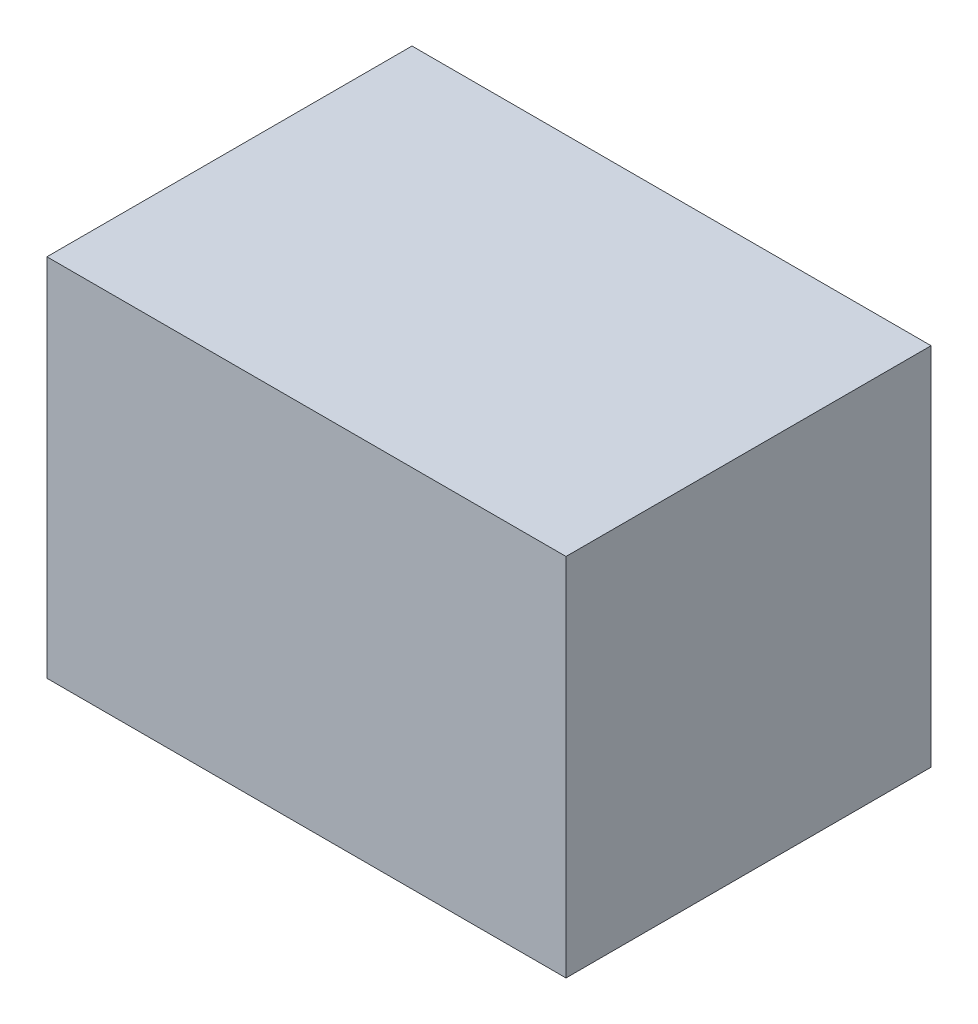
ISO-10303-21;
HEADER;
FILE_DESCRIPTION(('STEP AP214'),'2;1');
FILE_NAME('part.step','',(''),(''),'','','');
FILE_SCHEMA(('AUTOMOTIVE_DESIGN { 1 0 10303 214 1 1 1 1 }'));
ENDSEC;
DATA;
#1=APPLICATION_CONTEXT('core data for automotive mechanical design processes');
#2=APPLICATION_PROTOCOL_DEFINITION('international standard','automotive_design',2000,#1);
#3=PRODUCT_CONTEXT('',#1,'mechanical');
#4=PRODUCT('Part','Part','',(#3));
#5=PRODUCT_RELATED_PRODUCT_CATEGORY('part','',(#4));
#6=PRODUCT_DEFINITION_FORMATION('','',#4);
#7=PRODUCT_DEFINITION_CONTEXT('part definition',#1,'design');
#8=PRODUCT_DEFINITION('design','',#6,#7);
#9=PRODUCT_DEFINITION_SHAPE('','',#8);
#10=(LENGTH_UNIT() NAMED_UNIT(*) SI_UNIT(.MILLI.,.METRE.));
#11=(NAMED_UNIT(*) PLANE_ANGLE_UNIT() SI_UNIT($,.RADIAN.));
#12=(NAMED_UNIT(*) SI_UNIT($,.STERADIAN.) SOLID_ANGLE_UNIT());
#13=UNCERTAINTY_MEASURE_WITH_UNIT(LENGTH_MEASURE(1.E-05),#10,'distance_accuracy_value','');
#14=(GEOMETRIC_REPRESENTATION_CONTEXT(3) GLOBAL_UNCERTAINTY_ASSIGNED_CONTEXT((#13)) GLOBAL_UNIT_ASSIGNED_CONTEXT((#10,
#11,#12)) REPRESENTATION_CONTEXT('',''));
#15=CARTESIAN_POINT('',(0.,0.,0.));
#16=DIRECTION('',(0.,0.,1.));
#17=DIRECTION('',(1.,0.,0.));
#18=AXIS2_PLACEMENT_3D('',#15,#16,#17);
#19=CARTESIAN_POINT('',(0.,64.,-64.));
#20=DIRECTION('',(0.,0.,-1.));
#21=DIRECTION('',(-1.,0.,0.));
#22=AXIS2_PLACEMENT_3D('',#19,#20,#21);
#23=PLANE('',#22);
#24=DIRECTION('',(1.,0.,0.));
#25=VECTOR('',#24,1.);
#26=CARTESIAN_POINT('',(0.,0.,-64.));
#27=LINE('',#26,#25);
#28=CARTESIAN_POINT('',(0.,0.,-64.));
#29=VERTEX_POINT('',#28);
#30=CARTESIAN_POINT('',(91.,0.,-64.));
#31=VERTEX_POINT('',#30);
#32=EDGE_CURVE('E99',#29,#31,#27,.T.);
#33=ORIENTED_EDGE('',*,*,#32,.F.);
#34=DIRECTION('',(0.,-1.,0.));
#35=VECTOR('',#34,1.);
#36=CARTESIAN_POINT('',(0.,64.,-64.));
#37=LINE('',#36,#35);
#38=CARTESIAN_POINT('',(0.,64.,-64.));
#39=VERTEX_POINT('',#38);
#40=EDGE_CURVE('E11',#39,#29,#37,.T.);
#41=ORIENTED_EDGE('',*,*,#40,.F.);
#42=DIRECTION('',(1.,0.,0.));
#43=VECTOR('',#42,1.);
#44=CARTESIAN_POINT('',(0.,64.,-64.));
#45=LINE('',#44,#43);
#46=CARTESIAN_POINT('',(91.,64.,-64.));
#47=VERTEX_POINT('',#46);
#48=EDGE_CURVE('E93',#39,#47,#45,.T.);
#49=ORIENTED_EDGE('',*,*,#48,.T.);
#50=DIRECTION('',(0.,-1.,0.));
#51=VECTOR('',#50,1.);
#52=CARTESIAN_POINT('',(91.,64.,-64.));
#53=LINE('',#52,#51);
#54=EDGE_CURVE('E74',#47,#31,#53,.T.);
#55=ORIENTED_EDGE('',*,*,#54,.T.);
#56=EDGE_LOOP('',(#33,#41,#49,#55));
#57=FACE_BOUND('',#56,.T.);
#58=ADVANCED_FACE('F36',(#57),#23,.T.);
#59=CARTESIAN_POINT('',(0.,64.,0.));
#60=DIRECTION('',(-1.,0.,0.));
#61=DIRECTION('',(0.,0.,1.));
#62=AXIS2_PLACEMENT_3D('',#59,#60,#61);
#63=PLANE('',#62);
#64=DIRECTION('',(0.,0.,-1.));
#65=VECTOR('',#64,1.);
#66=CARTESIAN_POINT('',(0.,0.,0.));
#67=LINE('',#66,#65);
#68=CARTESIAN_POINT('',(0.,0.,0.));
#69=VERTEX_POINT('',#68);
#70=EDGE_CURVE('E87',#69,#29,#67,.T.);
#71=ORIENTED_EDGE('',*,*,#70,.F.);
#72=DIRECTION('',(0.,-1.,0.));
#73=VECTOR('',#72,1.);
#74=CARTESIAN_POINT('',(0.,64.,0.));
#75=LINE('',#74,#73);
#76=CARTESIAN_POINT('',(0.,64.,0.));
#77=VERTEX_POINT('',#76);
#78=EDGE_CURVE('E44',#77,#69,#75,.T.);
#79=ORIENTED_EDGE('',*,*,#78,.F.);
#80=DIRECTION('',(0.,0.,-1.));
#81=VECTOR('',#80,1.);
#82=CARTESIAN_POINT('',(0.,64.,0.));
#83=LINE('',#82,#81);
#84=EDGE_CURVE('E85',#77,#39,#83,.T.);
#85=ORIENTED_EDGE('',*,*,#84,.T.);
#86=ORIENTED_EDGE('',*,*,#40,.T.);
#87=EDGE_LOOP('',(#71,#79,#85,#86));
#88=FACE_BOUND('',#87,.T.);
#89=ADVANCED_FACE('F83',(#88),#63,.T.);
#90=CARTESIAN_POINT('',(0.,64.,0.));
#91=DIRECTION('',(0.,0.,-1.));
#92=DIRECTION('',(-1.,0.,0.));
#93=AXIS2_PLACEMENT_3D('',#90,#91,#92);
#94=PLANE('',#93);
#95=DIRECTION('',(1.,0.,0.));
#96=VECTOR('',#95,1.);
#97=CARTESIAN_POINT('',(0.,0.,0.));
#98=LINE('',#97,#96);
#99=CARTESIAN_POINT('',(91.,0.,0.));
#100=VERTEX_POINT('',#99);
#101=EDGE_CURVE('E67',#69,#100,#98,.T.);
#102=ORIENTED_EDGE('',*,*,#101,.T.);
#103=DIRECTION('',(0.,-1.,0.));
#104=VECTOR('',#103,1.);
#105=CARTESIAN_POINT('',(91.,64.,0.));
#106=LINE('',#105,#104);
#107=CARTESIAN_POINT('',(91.,64.,0.));
#108=VERTEX_POINT('',#107);
#109=EDGE_CURVE('E88',#108,#100,#106,.T.);
#110=ORIENTED_EDGE('',*,*,#109,.F.);
#111=DIRECTION('',(1.,0.,0.));
#112=VECTOR('',#111,1.);
#113=CARTESIAN_POINT('',(0.,64.,0.));
#114=LINE('',#113,#112);
#115=EDGE_CURVE('E89',#77,#108,#114,.T.);
#116=ORIENTED_EDGE('',*,*,#115,.F.);
#117=ORIENTED_EDGE('',*,*,#78,.T.);
#118=EDGE_LOOP('',(#102,#110,#116,#117));
#119=FACE_BOUND('',#118,.T.);
#120=ADVANCED_FACE('F90',(#119),#94,.F.);
#121=CARTESIAN_POINT('',(91.,64.,0.));
#122=DIRECTION('',(-1.,0.,0.));
#123=DIRECTION('',(0.,0.,1.));
#124=AXIS2_PLACEMENT_3D('',#121,#122,#123);
#125=PLANE('',#124);
#126=DIRECTION('',(0.,0.,-1.));
#127=VECTOR('',#126,1.);
#128=CARTESIAN_POINT('',(91.,0.,0.));
#129=LINE('',#128,#127);
#130=EDGE_CURVE('E95',#100,#31,#129,.T.);
#131=ORIENTED_EDGE('',*,*,#130,.T.);
#132=ORIENTED_EDGE('',*,*,#54,.F.);
#133=DIRECTION('',(0.,0.,-1.));
#134=VECTOR('',#133,1.);
#135=CARTESIAN_POINT('',(91.,64.,0.));
#136=LINE('',#135,#134);
#137=EDGE_CURVE('E52',#108,#47,#136,.T.);
#138=ORIENTED_EDGE('',*,*,#137,.F.);
#139=ORIENTED_EDGE('',*,*,#109,.T.);
#140=EDGE_LOOP('',(#131,#132,#138,#139));
#141=FACE_BOUND('',#140,.T.);
#142=ADVANCED_FACE('F108',(#141),#125,.F.);
#143=CARTESIAN_POINT('',(0.,64.,0.));
#144=DIRECTION('',(0.,1.,0.));
#145=DIRECTION('',(0.,0.,1.));
#146=AXIS2_PLACEMENT_3D('',#143,#144,#145);
#147=PLANE('',#146);
#148=ORIENTED_EDGE('',*,*,#48,.F.);
#149=ORIENTED_EDGE('',*,*,#84,.F.);
#150=ORIENTED_EDGE('',*,*,#115,.T.);
#151=ORIENTED_EDGE('',*,*,#137,.T.);
#152=EDGE_LOOP('',(#148,#149,#150,#151));
#153=FACE_BOUND('',#152,.T.);
#154=ADVANCED_FACE('F92',(#153),#147,.T.);
#155=CARTESIAN_POINT('',(0.,0.,0.));
#156=DIRECTION('',(0.,1.,0.));
#157=DIRECTION('',(0.,0.,1.));
#158=AXIS2_PLACEMENT_3D('',#155,#156,#157);
#159=PLANE('',#158);
#160=ORIENTED_EDGE('',*,*,#32,.T.);
#161=ORIENTED_EDGE('',*,*,#130,.F.);
#162=ORIENTED_EDGE('',*,*,#101,.F.);
#163=ORIENTED_EDGE('',*,*,#70,.T.);
#164=EDGE_LOOP('',(#160,#161,#162,#163));
#165=FACE_BOUND('',#164,.T.);
#166=ADVANCED_FACE('F110',(#165),#159,.F.);
#167=CLOSED_SHELL('',(#58,#89,#120,#142,#154,#166));
#168=MANIFOLD_SOLID_BREP('B2',#167);
#169=ADVANCED_BREP_SHAPE_REPRESENTATION('',(#18,#168),#14);
#170=SHAPE_DEFINITION_REPRESENTATION(#9,#169);
ENDSEC;
END-ISO-10303-21;
